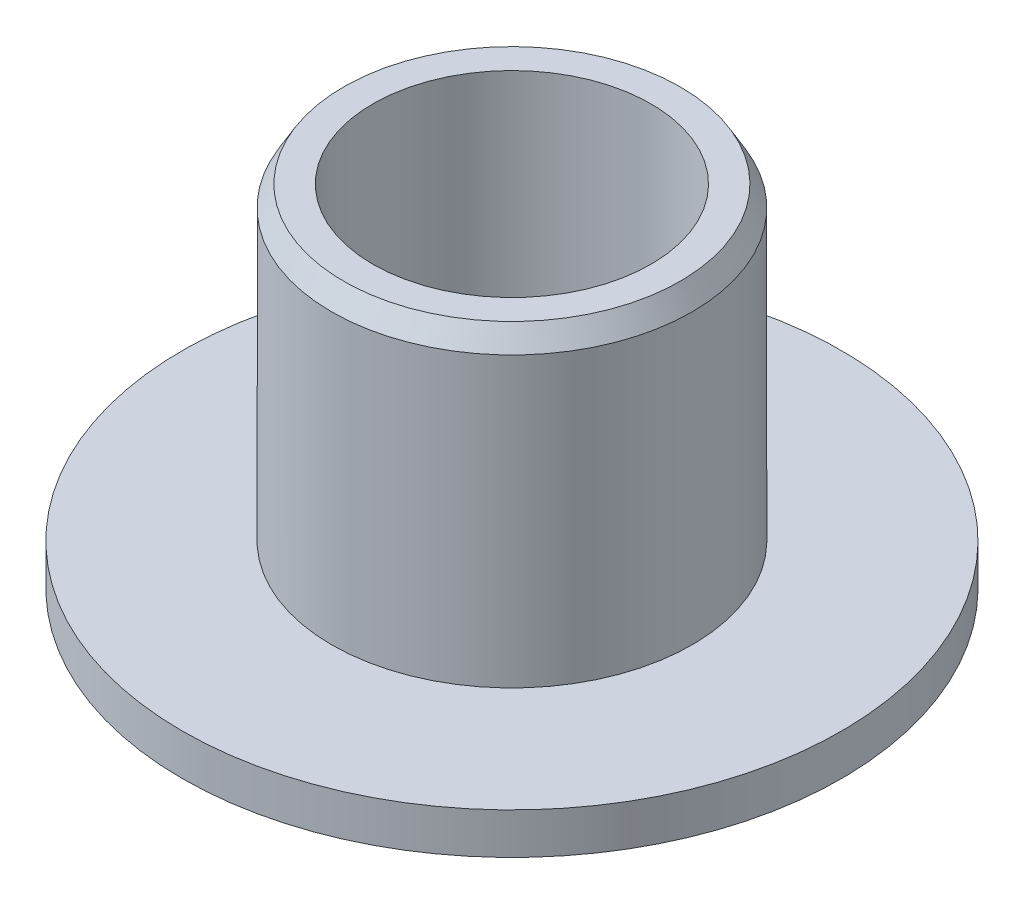
ISO-10303-21;
HEADER;
FILE_DESCRIPTION(('STEP AP214'),'2;1');
FILE_NAME('part.step','',(''),(''),'','','');
FILE_SCHEMA(('AUTOMOTIVE_DESIGN { 1 0 10303 214 1 1 1 1 }'));
ENDSEC;
DATA;
#1=APPLICATION_CONTEXT('core data for automotive mechanical design processes');
#2=APPLICATION_PROTOCOL_DEFINITION('international standard','automotive_design',2000,#1);
#3=PRODUCT_CONTEXT('',#1,'mechanical');
#4=PRODUCT('Part','Part','',(#3));
#5=PRODUCT_RELATED_PRODUCT_CATEGORY('part','',(#4));
#6=PRODUCT_DEFINITION_FORMATION('','',#4);
#7=PRODUCT_DEFINITION_CONTEXT('part definition',#1,'design');
#8=PRODUCT_DEFINITION('design','',#6,#7);
#9=PRODUCT_DEFINITION_SHAPE('','',#8);
#10=(LENGTH_UNIT() NAMED_UNIT(*) SI_UNIT(.MILLI.,.METRE.));
#11=(NAMED_UNIT(*) PLANE_ANGLE_UNIT() SI_UNIT($,.RADIAN.));
#12=(NAMED_UNIT(*) SI_UNIT($,.STERADIAN.) SOLID_ANGLE_UNIT());
#13=UNCERTAINTY_MEASURE_WITH_UNIT(LENGTH_MEASURE(1.E-05),#10,'distance_accuracy_value','');
#14=(GEOMETRIC_REPRESENTATION_CONTEXT(3) GLOBAL_UNCERTAINTY_ASSIGNED_CONTEXT((#13)) GLOBAL_UNIT_ASSIGNED_CONTEXT((#10,
#11,#12)) REPRESENTATION_CONTEXT('',''));
#15=CARTESIAN_POINT('',(0.,0.,0.));
#16=DIRECTION('',(0.,0.,1.));
#17=DIRECTION('',(1.,0.,0.));
#18=AXIS2_PLACEMENT_3D('',#15,#16,#17);
#19=CARTESIAN_POINT('',(0.,2.,0.));
#20=DIRECTION('',(0.,-1.,0.));
#21=DIRECTION('',(0.,0.,-1.));
#22=AXIS2_PLACEMENT_3D('',#19,#20,#21);
#23=PLANE('',#22);
#24=CARTESIAN_POINT('',(0.,2.,0.));
#25=DIRECTION('',(0.,1.,0.));
#26=DIRECTION('',(0.,0.,1.));
#27=AXIS2_PLACEMENT_3D('',#24,#25,#26);
#28=CIRCLE('',#27,6.75);
#29=CARTESIAN_POINT('',(0.,2.,6.75));
#30=VERTEX_POINT('',#29);
#31=EDGE_CURVE('E57',#30,#30,#28,.T.);
#32=ORIENTED_EDGE('',*,*,#31,.T.);
#33=EDGE_LOOP('',(#32));
#34=FACE_BOUND('',#33,.T.);
#35=ADVANCED_FACE('F43',(#34),#23,.F.);
#36=CARTESIAN_POINT('',(0.,21.6230439326638,0.));
#37=DIRECTION('',(0.,1.,0.));
#38=DIRECTION('',(0.,0.,1.));
#39=AXIS2_PLACEMENT_3D('',#36,#37,#38);
#40=CYLINDRICAL_SURFACE('',#39,6.75);
#41=ORIENTED_EDGE('',*,*,#31,.F.);
#42=EDGE_LOOP('',(#41));
#43=FACE_BOUND('',#42,.T.);
#44=CARTESIAN_POINT('',(0.,17.,0.));
#45=DIRECTION('',(0.,1.,0.));
#46=DIRECTION('',(0.,0.,1.));
#47=AXIS2_PLACEMENT_3D('',#44,#45,#46);
#48=CIRCLE('',#47,6.75);
#49=CARTESIAN_POINT('',(0.,17.,6.75));
#50=VERTEX_POINT('',#49);
#51=EDGE_CURVE('E62',#50,#50,#48,.T.);
#52=ORIENTED_EDGE('',*,*,#51,.T.);
#53=EDGE_LOOP('',(#52));
#54=FACE_BOUND('',#53,.T.);
#55=ADVANCED_FACE('F95',(#43,#54),#40,.F.);
#56=CARTESIAN_POINT('',(6.75,17.,0.));
#57=DIRECTION('',(0.,-1.,0.));
#58=DIRECTION('',(0.,0.,-1.));
#59=AXIS2_PLACEMENT_3D('',#56,#57,#58);
#60=PLANE('',#59);
#61=CARTESIAN_POINT('',(0.,17.,0.));
#62=DIRECTION('',(0.,-1.,0.));
#63=DIRECTION('',(0.,0.,-1.));
#64=AXIS2_PLACEMENT_3D('',#61,#62,#63);
#65=CIRCLE('',#64,8.17264973081037);
#66=CARTESIAN_POINT('',(0.,17.,-8.17264973081037));
#67=VERTEX_POINT('',#66);
#68=EDGE_CURVE('E52',#67,#67,#65,.F.);
#69=ORIENTED_EDGE('',*,*,#68,.T.);
#70=EDGE_LOOP('',(#69));
#71=FACE_BOUND('',#70,.T.);
#72=ORIENTED_EDGE('',*,*,#51,.F.);
#73=EDGE_LOOP('',(#72));
#74=FACE_BOUND('',#73,.T.);
#75=ADVANCED_FACE('F100',(#71,#74),#60,.F.);
#76=CARTESIAN_POINT('',(0.,21.6230439326638,0.));
#77=DIRECTION('',(0.,1.,0.));
#78=DIRECTION('',(0.,0.,1.));
#79=AXIS2_PLACEMENT_3D('',#76,#77,#78);
#80=CYLINDRICAL_SURFACE('',#79,8.75);
#81=CARTESIAN_POINT('',(0.,16.,0.));
#82=DIRECTION('',(0.,-1.,0.));
#83=DIRECTION('',(0.,0.,-1.));
#84=AXIS2_PLACEMENT_3D('',#81,#82,#83);
#85=CIRCLE('',#84,8.75);
#86=CARTESIAN_POINT('',(0.,16.,-8.75));
#87=VERTEX_POINT('',#86);
#88=EDGE_CURVE('E10',#87,#87,#85,.T.);
#89=ORIENTED_EDGE('',*,*,#88,.T.);
#90=EDGE_LOOP('',(#89));
#91=FACE_BOUND('',#90,.T.);
#92=CARTESIAN_POINT('',(0.,2.,0.));
#93=DIRECTION('',(0.,1.,0.));
#94=DIRECTION('',(0.,0.,1.));
#95=AXIS2_PLACEMENT_3D('',#92,#93,#94);
#96=CIRCLE('',#95,8.75);
#97=CARTESIAN_POINT('',(0.,2.,8.75));
#98=VERTEX_POINT('',#97);
#99=EDGE_CURVE('E68',#98,#98,#96,.T.);
#100=ORIENTED_EDGE('',*,*,#99,.T.);
#101=EDGE_LOOP('',(#100));
#102=FACE_BOUND('',#101,.T.);
#103=ADVANCED_FACE('F106',(#91,#102),#80,.T.);
#104=CARTESIAN_POINT('',(16.,2.,0.));
#105=DIRECTION('',(0.,-1.,0.));
#106=DIRECTION('',(0.,0.,-1.));
#107=AXIS2_PLACEMENT_3D('',#104,#105,#106);
#108=PLANE('',#107);
#109=ORIENTED_EDGE('',*,*,#99,.F.);
#110=EDGE_LOOP('',(#109));
#111=FACE_BOUND('',#110,.T.);
#112=CARTESIAN_POINT('',(0.,2.,0.));
#113=DIRECTION('',(0.,1.,0.));
#114=DIRECTION('',(0.,0.,1.));
#115=AXIS2_PLACEMENT_3D('',#112,#113,#114);
#116=CIRCLE('',#115,16.);
#117=CARTESIAN_POINT('',(0.,2.,16.));
#118=VERTEX_POINT('',#117);
#119=EDGE_CURVE('E72',#118,#118,#116,.T.);
#120=ORIENTED_EDGE('',*,*,#119,.T.);
#121=EDGE_LOOP('',(#120));
#122=FACE_BOUND('',#121,.T.);
#123=ADVANCED_FACE('F91',(#111,#122),#108,.F.);
#124=CARTESIAN_POINT('',(0.,21.6230439326638,0.));
#125=DIRECTION('',(0.,1.,0.));
#126=DIRECTION('',(0.,0.,1.));
#127=AXIS2_PLACEMENT_3D('',#124,#125,#126);
#128=CYLINDRICAL_SURFACE('',#127,16.);
#129=ORIENTED_EDGE('',*,*,#119,.F.);
#130=EDGE_LOOP('',(#129));
#131=FACE_BOUND('',#130,.T.);
#132=CARTESIAN_POINT('',(0.,0.,0.));
#133=DIRECTION('',(0.,1.,0.));
#134=DIRECTION('',(0.,0.,1.));
#135=AXIS2_PLACEMENT_3D('',#132,#133,#134);
#136=CIRCLE('',#135,16.);
#137=CARTESIAN_POINT('',(0.,0.,16.));
#138=VERTEX_POINT('',#137);
#139=EDGE_CURVE('E76',#138,#138,#136,.T.);
#140=ORIENTED_EDGE('',*,*,#139,.T.);
#141=EDGE_LOOP('',(#140));
#142=FACE_BOUND('',#141,.T.);
#143=ADVANCED_FACE('F81',(#131,#142),#128,.T.);
#144=CARTESIAN_POINT('',(0.,0.,0.));
#145=DIRECTION('',(0.,1.,0.));
#146=DIRECTION('',(0.,0.,1.));
#147=AXIS2_PLACEMENT_3D('',#144,#145,#146);
#148=PLANE('',#147);
#149=ORIENTED_EDGE('',*,*,#139,.F.);
#150=EDGE_LOOP('',(#149));
#151=FACE_BOUND('',#150,.T.);
#152=ADVANCED_FACE('F83',(#151),#148,.F.);
#153=CARTESIAN_POINT('',(0.,17.,0.));
#154=DIRECTION('',(0.,-1.,0.));
#155=DIRECTION('',(0.,0.,-1.));
#156=AXIS2_PLACEMENT_3D('',#153,#154,#155);
#157=CONICAL_SURFACE('',#156,8.17264973081037,0.523598775598299);
#158=ORIENTED_EDGE('',*,*,#88,.F.);
#159=EDGE_LOOP('',(#158));
#160=FACE_BOUND('',#159,.T.);
#161=ORIENTED_EDGE('',*,*,#68,.F.);
#162=EDGE_LOOP('',(#161));
#163=FACE_BOUND('',#162,.T.);
#164=ADVANCED_FACE('F46',(#160,#163),#157,.T.);
#165=CLOSED_SHELL('',(#35,#55,#75,#103,#123,#143,#152,#164));
#166=MANIFOLD_SOLID_BREP('B2',#165);
#167=ADVANCED_BREP_SHAPE_REPRESENTATION('',(#18,#166),#14);
#168=SHAPE_DEFINITION_REPRESENTATION(#9,#167);
ENDSEC;
END-ISO-10303-21;
